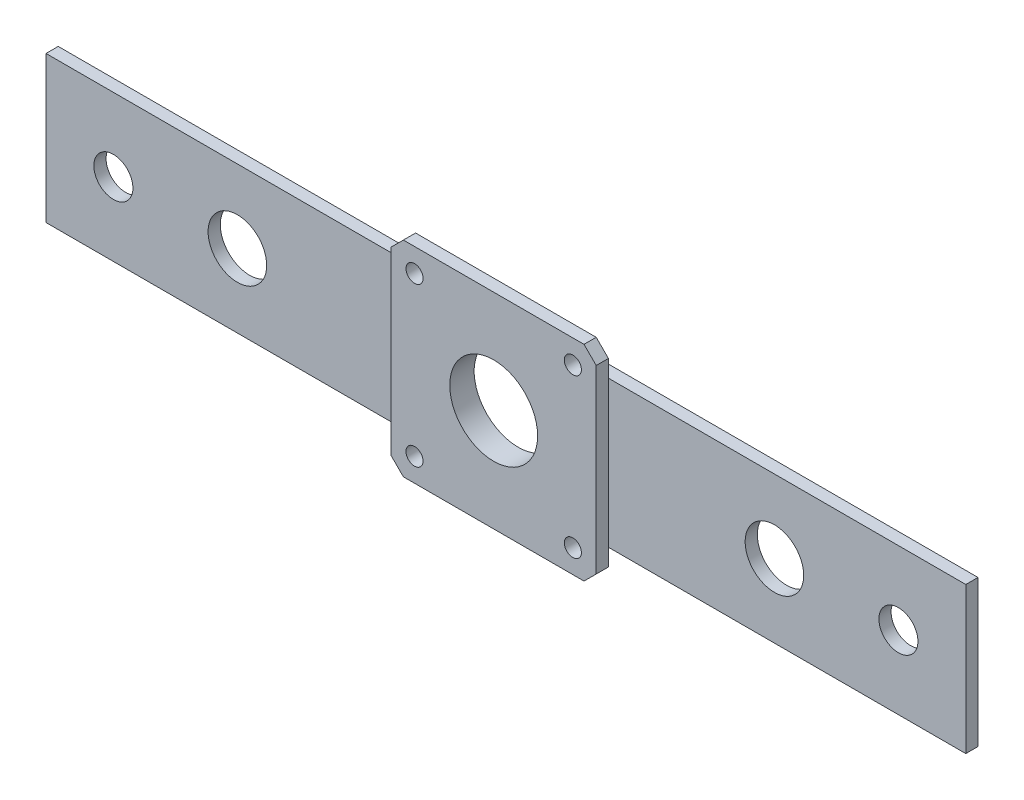
ISO-10303-21;
HEADER;
FILE_DESCRIPTION(('STEP AP214'),'2;1');
FILE_NAME('part.step','',(''),(''),'','','');
FILE_SCHEMA(('AUTOMOTIVE_DESIGN { 1 0 10303 214 1 1 1 1 }'));
ENDSEC;
DATA;
#1=APPLICATION_CONTEXT('core data for automotive mechanical design processes');
#2=APPLICATION_PROTOCOL_DEFINITION('international standard','automotive_design',2000,#1);
#3=PRODUCT_CONTEXT('',#1,'mechanical');
#4=PRODUCT('Part','Part','',(#3));
#5=PRODUCT_RELATED_PRODUCT_CATEGORY('part','',(#4));
#6=PRODUCT_DEFINITION_FORMATION('','',#4);
#7=PRODUCT_DEFINITION_CONTEXT('part definition',#1,'design');
#8=PRODUCT_DEFINITION('design','',#6,#7);
#9=PRODUCT_DEFINITION_SHAPE('','',#8);
#10=(LENGTH_UNIT() NAMED_UNIT(*) SI_UNIT(.MILLI.,.METRE.));
#11=(NAMED_UNIT(*) PLANE_ANGLE_UNIT() SI_UNIT($,.RADIAN.));
#12=(NAMED_UNIT(*) SI_UNIT($,.STERADIAN.) SOLID_ANGLE_UNIT());
#13=UNCERTAINTY_MEASURE_WITH_UNIT(LENGTH_MEASURE(1.E-05),#10,'distance_accuracy_value','');
#14=(GEOMETRIC_REPRESENTATION_CONTEXT(3) GLOBAL_UNCERTAINTY_ASSIGNED_CONTEXT((#13)) GLOBAL_UNIT_ASSIGNED_CONTEXT((#10,
#11,#12)) REPRESENTATION_CONTEXT('',''));
#15=CARTESIAN_POINT('',(0.,0.,0.));
#16=DIRECTION('',(0.,0.,1.));
#17=DIRECTION('',(1.,0.,0.));
#18=AXIS2_PLACEMENT_3D('',#15,#16,#17);
#19=CARTESIAN_POINT('',(0.,0.,0.));
#20=DIRECTION('',(0.,0.,1.));
#21=DIRECTION('',(1.,0.,0.));
#22=AXIS2_PLACEMENT_3D('',#19,#20,#21);
#23=PLANE('',#22);
#24=DIRECTION('',(0.,1.,0.));
#25=VECTOR('',#24,1.);
#26=CARTESIAN_POINT('',(94.2,15.,0.));
#27=LINE('',#26,#25);
#28=CARTESIAN_POINT('',(94.2,-15.,0.));
#29=VERTEX_POINT('',#28);
#30=CARTESIAN_POINT('',(94.2,15.,0.));
#31=VERTEX_POINT('',#30);
#32=EDGE_CURVE('E226',#29,#31,#27,.T.);
#33=ORIENTED_EDGE('',*,*,#32,.F.);
#34=DIRECTION('',(1.,0.,0.));
#35=VECTOR('',#34,1.);
#36=CARTESIAN_POINT('',(-94.2,-15.,0.));
#37=LINE('',#36,#35);
#38=CARTESIAN_POINT('',(-94.2,-15.,0.));
#39=VERTEX_POINT('',#38);
#40=EDGE_CURVE('E81',#39,#29,#37,.T.);
#41=ORIENTED_EDGE('',*,*,#40,.F.);
#42=DIRECTION('',(0.,-1.,0.));
#43=VECTOR('',#42,1.);
#44=CARTESIAN_POINT('',(-94.2,15.,0.));
#45=LINE('',#44,#43);
#46=CARTESIAN_POINT('',(-94.2,15.,0.));
#47=VERTEX_POINT('',#46);
#48=EDGE_CURVE('E245',#47,#39,#45,.T.);
#49=ORIENTED_EDGE('',*,*,#48,.F.);
#50=DIRECTION('',(-1.,0.,0.));
#51=VECTOR('',#50,1.);
#52=CARTESIAN_POINT('',(-94.2,15.,0.));
#53=LINE('',#52,#51);
#54=EDGE_CURVE('E243',#31,#47,#53,.T.);
#55=ORIENTED_EDGE('',*,*,#54,.F.);
#56=EDGE_LOOP('',(#33,#41,#49,#55));
#57=FACE_BOUND('',#56,.T.);
#58=CARTESIAN_POINT('',(-55.,0.,0.));
#59=DIRECTION('',(0.,0.,1.));
#60=DIRECTION('',(1.,0.,0.));
#61=AXIS2_PLACEMENT_3D('',#58,#59,#60);
#62=CIRCLE('',#61,6.00000000000001);
#63=CARTESIAN_POINT('',(-49.,0.,0.));
#64=VERTEX_POINT('',#63);
#65=EDGE_CURVE('E223',#64,#64,#62,.T.);
#66=ORIENTED_EDGE('',*,*,#65,.T.);
#67=EDGE_LOOP('',(#66));
#68=FACE_BOUND('',#67,.T.);
#69=CARTESIAN_POINT('',(-80.4,0.,0.));
#70=DIRECTION('',(0.,0.,1.));
#71=DIRECTION('',(1.,0.,0.));
#72=AXIS2_PLACEMENT_3D('',#69,#70,#71);
#73=CIRCLE('',#72,4.00000000000001);
#74=CARTESIAN_POINT('',(-76.4,0.,0.));
#75=VERTEX_POINT('',#74);
#76=EDGE_CURVE('E217',#75,#75,#73,.T.);
#77=ORIENTED_EDGE('',*,*,#76,.T.);
#78=EDGE_LOOP('',(#77));
#79=FACE_BOUND('',#78,.T.);
#80=CARTESIAN_POINT('',(55.,0.,0.));
#81=DIRECTION('',(0.,0.,1.));
#82=DIRECTION('',(-1.,0.,0.));
#83=AXIS2_PLACEMENT_3D('',#80,#81,#82);
#84=CIRCLE('',#83,6.00000000000001);
#85=CARTESIAN_POINT('',(49.,0.,0.));
#86=VERTEX_POINT('',#85);
#87=EDGE_CURVE('E211',#86,#86,#84,.T.);
#88=ORIENTED_EDGE('',*,*,#87,.T.);
#89=EDGE_LOOP('',(#88));
#90=FACE_BOUND('',#89,.T.);
#91=CARTESIAN_POINT('',(80.4,0.,0.));
#92=DIRECTION('',(0.,0.,1.));
#93=DIRECTION('',(-1.,0.,0.));
#94=AXIS2_PLACEMENT_3D('',#91,#92,#93);
#95=CIRCLE('',#94,4.00000000000001);
#96=CARTESIAN_POINT('',(76.4,0.,0.));
#97=VERTEX_POINT('',#96);
#98=EDGE_CURVE('E202',#97,#97,#95,.T.);
#99=ORIENTED_EDGE('',*,*,#98,.T.);
#100=EDGE_LOOP('',(#99));
#101=FACE_BOUND('',#100,.T.);
#102=CARTESIAN_POINT('',(0.,0.,0.));
#103=DIRECTION('',(0.,0.,1.));
#104=DIRECTION('',(1.,0.,0.));
#105=AXIS2_PLACEMENT_3D('',#102,#103,#104);
#106=CIRCLE('',#105,9.);
#107=CARTESIAN_POINT('',(9.,0.,0.));
#108=VERTEX_POINT('',#107);
#109=EDGE_CURVE('E309',#108,#108,#106,.F.);
#110=ORIENTED_EDGE('',*,*,#109,.F.);
#111=EDGE_LOOP('',(#110));
#112=FACE_BOUND('',#111,.T.);
#113=ADVANCED_FACE('F32',(#57,#68,#79,#90,#101,#112),#23,.F.);
#114=CARTESIAN_POINT('',(0.,0.,5.));
#115=DIRECTION('',(0.,0.,-1.));
#116=DIRECTION('',(-1.,0.,0.));
#117=AXIS2_PLACEMENT_3D('',#114,#115,#116);
#118=PLANE('',#117);
#119=CARTESIAN_POINT('',(-16.2144660940673,16.2144660940673,5.));
#120=DIRECTION('',(0.,0.,1.));
#121=DIRECTION('',(-1.,0.,0.));
#122=AXIS2_PLACEMENT_3D('',#119,#120,#121);
#123=CIRCLE('',#122,1.75);
#124=CARTESIAN_POINT('',(-17.9644660940673,16.2144660940673,5.));
#125=VERTEX_POINT('',#124);
#126=EDGE_CURVE('E306',#125,#125,#123,.T.);
#127=ORIENTED_EDGE('',*,*,#126,.F.);
#128=EDGE_LOOP('',(#127));
#129=FACE_BOUND('',#128,.T.);
#130=CARTESIAN_POINT('',(-16.2144660940673,-16.2144660940673,5.));
#131=DIRECTION('',(0.,0.,1.));
#132=DIRECTION('',(-1.,0.,0.));
#133=AXIS2_PLACEMENT_3D('',#130,#131,#132);
#134=CIRCLE('',#133,1.75000000000001);
#135=CARTESIAN_POINT('',(-17.9644660940673,-16.2144660940673,5.));
#136=VERTEX_POINT('',#135);
#137=EDGE_CURVE('E292',#136,#136,#134,.T.);
#138=ORIENTED_EDGE('',*,*,#137,.F.);
#139=EDGE_LOOP('',(#138));
#140=FACE_BOUND('',#139,.T.);
#141=DIRECTION('',(-1.,0.,0.));
#142=VECTOR('',#141,1.);
#143=CARTESIAN_POINT('',(-18.5,21.,5.));
#144=LINE('',#143,#142);
#145=CARTESIAN_POINT('',(18.5,21.,5.));
#146=VERTEX_POINT('',#145);
#147=CARTESIAN_POINT('',(-18.5,21.,5.));
#148=VERTEX_POINT('',#147);
#149=EDGE_CURVE('E184',#146,#148,#144,.T.);
#150=ORIENTED_EDGE('',*,*,#149,.T.);
#151=DIRECTION('',(-0.707106781186547,-0.707106781186547,0.));
#152=VECTOR('',#151,1.);
#153=CARTESIAN_POINT('',(-21.,18.5,5.));
#154=LINE('',#153,#152);
#155=CARTESIAN_POINT('',(-21.,18.5,5.));
#156=VERTEX_POINT('',#155);
#157=EDGE_CURVE('E173',#148,#156,#154,.T.);
#158=ORIENTED_EDGE('',*,*,#157,.T.);
#159=DIRECTION('',(0.,-1.,0.));
#160=VECTOR('',#159,1.);
#161=CARTESIAN_POINT('',(-21.,18.5,5.));
#162=LINE('',#161,#160);
#163=CARTESIAN_POINT('',(-21.,-18.5,5.));
#164=VERTEX_POINT('',#163);
#165=EDGE_CURVE('E183',#156,#164,#162,.T.);
#166=ORIENTED_EDGE('',*,*,#165,.T.);
#167=DIRECTION('',(0.707106781186547,-0.707106781186547,0.));
#168=VECTOR('',#167,1.);
#169=CARTESIAN_POINT('',(-21.,-18.5,5.));
#170=LINE('',#169,#168);
#171=CARTESIAN_POINT('',(-18.5,-21.,5.));
#172=VERTEX_POINT('',#171);
#173=EDGE_CURVE('E280',#164,#172,#170,.T.);
#174=ORIENTED_EDGE('',*,*,#173,.T.);
#175=DIRECTION('',(1.,0.,0.));
#176=VECTOR('',#175,1.);
#177=CARTESIAN_POINT('',(-18.5,-21.,5.));
#178=LINE('',#177,#176);
#179=CARTESIAN_POINT('',(18.5,-21.,5.));
#180=VERTEX_POINT('',#179);
#181=EDGE_CURVE('E278',#172,#180,#178,.T.);
#182=ORIENTED_EDGE('',*,*,#181,.T.);
#183=DIRECTION('',(0.707106781186547,0.707106781186547,0.));
#184=VECTOR('',#183,1.);
#185=CARTESIAN_POINT('',(18.5,-21.,5.));
#186=LINE('',#185,#184);
#187=CARTESIAN_POINT('',(21.,-18.5,5.));
#188=VERTEX_POINT('',#187);
#189=EDGE_CURVE('E276',#180,#188,#186,.T.);
#190=ORIENTED_EDGE('',*,*,#189,.T.);
#191=DIRECTION('',(0.,1.,0.));
#192=VECTOR('',#191,1.);
#193=CARTESIAN_POINT('',(21.,18.5,5.));
#194=LINE('',#193,#192);
#195=CARTESIAN_POINT('',(21.,18.5,5.));
#196=VERTEX_POINT('',#195);
#197=EDGE_CURVE('E274',#188,#196,#194,.T.);
#198=ORIENTED_EDGE('',*,*,#197,.T.);
#199=DIRECTION('',(-0.707106781186547,0.707106781186547,0.));
#200=VECTOR('',#199,1.);
#201=CARTESIAN_POINT('',(18.5,21.,5.));
#202=LINE('',#201,#200);
#203=EDGE_CURVE('E190',#196,#146,#202,.T.);
#204=ORIENTED_EDGE('',*,*,#203,.T.);
#205=EDGE_LOOP('',(#150,#158,#166,#174,#182,#190,#198,#204));
#206=FACE_BOUND('',#205,.T.);
#207=CARTESIAN_POINT('',(16.2144660940673,16.2144660940673,5.));
#208=DIRECTION('',(0.,0.,1.));
#209=DIRECTION('',(1.,0.,0.));
#210=AXIS2_PLACEMENT_3D('',#207,#208,#209);
#211=CIRCLE('',#210,1.75);
#212=CARTESIAN_POINT('',(17.9644660940673,16.2144660940673,5.));
#213=VERTEX_POINT('',#212);
#214=EDGE_CURVE('E269',#213,#213,#211,.T.);
#215=ORIENTED_EDGE('',*,*,#214,.F.);
#216=EDGE_LOOP('',(#215));
#217=FACE_BOUND('',#216,.T.);
#218=CARTESIAN_POINT('',(16.2144660940673,-16.2144660940673,5.));
#219=DIRECTION('',(0.,0.,1.));
#220=DIRECTION('',(1.,0.,0.));
#221=AXIS2_PLACEMENT_3D('',#218,#219,#220);
#222=CIRCLE('',#221,1.75);
#223=CARTESIAN_POINT('',(17.9644660940673,-16.2144660940673,5.));
#224=VERTEX_POINT('',#223);
#225=EDGE_CURVE('E299',#224,#224,#222,.T.);
#226=ORIENTED_EDGE('',*,*,#225,.F.);
#227=EDGE_LOOP('',(#226));
#228=FACE_BOUND('',#227,.T.);
#229=CARTESIAN_POINT('',(0.,0.,5.));
#230=DIRECTION('',(0.,0.,-1.));
#231=DIRECTION('',(-1.,0.,0.));
#232=AXIS2_PLACEMENT_3D('',#229,#230,#231);
#233=CIRCLE('',#232,9.);
#234=CARTESIAN_POINT('',(-9.,0.,5.));
#235=VERTEX_POINT('',#234);
#236=EDGE_CURVE('E36',#235,#235,#233,.F.);
#237=ORIENTED_EDGE('',*,*,#236,.F.);
#238=EDGE_LOOP('',(#237));
#239=FACE_BOUND('',#238,.T.);
#240=ADVANCED_FACE('F187',(#129,#140,#206,#217,#228,#239),#118,.F.);
#241=CARTESIAN_POINT('',(0.,0.,2.5));
#242=DIRECTION('',(0.,0.,1.));
#243=DIRECTION('',(1.,0.,0.));
#244=AXIS2_PLACEMENT_3D('',#241,#242,#243);
#245=PLANE('',#244);
#246=DIRECTION('',(1.,0.,0.));
#247=VECTOR('',#246,1.);
#248=CARTESIAN_POINT('',(-94.2,-15.,2.5));
#249=LINE('',#248,#247);
#250=CARTESIAN_POINT('',(14.9544771630203,-15.,2.5));
#251=VERTEX_POINT('',#250);
#252=CARTESIAN_POINT('',(17.4744550251143,-15.,2.5));
#253=VERTEX_POINT('',#252);
#254=EDGE_CURVE('E414',#251,#253,#249,.T.);
#255=ORIENTED_EDGE('',*,*,#254,.T.);
#256=CARTESIAN_POINT('',(16.2144660940673,-16.2144660940673,2.5));
#257=DIRECTION('',(0.,0.,1.));
#258=DIRECTION('',(1.,0.,0.));
#259=AXIS2_PLACEMENT_3D('',#256,#257,#258);
#260=CIRCLE('',#259,1.75);
#261=EDGE_CURVE('E296',#253,#251,#260,.T.);
#262=ORIENTED_EDGE('',*,*,#261,.T.);
#263=EDGE_LOOP('',(#255,#262));
#264=FACE_BOUND('',#263,.T.);
#265=ADVANCED_FACE('F319',(#264),#245,.T.);
#266=DIRECTION('',(-1.,0.,0.));
#267=VECTOR('',#266,1.);
#268=CARTESIAN_POINT('',(-94.2,15.,2.5));
#269=LINE('',#268,#267);
#270=CARTESIAN_POINT('',(17.4744550251143,15.,2.5));
#271=VERTEX_POINT('',#270);
#272=CARTESIAN_POINT('',(14.9544771630202,15.,2.5));
#273=VERTEX_POINT('',#272);
#274=EDGE_CURVE('E454',#271,#273,#269,.T.);
#275=ORIENTED_EDGE('',*,*,#274,.T.);
#276=CARTESIAN_POINT('',(16.2144660940673,16.2144660940673,2.5));
#277=DIRECTION('',(0.,0.,1.));
#278=DIRECTION('',(1.,0.,0.));
#279=AXIS2_PLACEMENT_3D('',#276,#277,#278);
#280=CIRCLE('',#279,1.75);
#281=EDGE_CURVE('E283',#273,#271,#280,.T.);
#282=ORIENTED_EDGE('',*,*,#281,.T.);
#283=EDGE_LOOP('',(#275,#282));
#284=FACE_BOUND('',#283,.T.);
#285=ADVANCED_FACE('F326',(#284),#245,.T.);
#286=DIRECTION('',(0.,1.,0.));
#287=VECTOR('',#286,1.);
#288=CARTESIAN_POINT('',(21.,18.5,2.5));
#289=LINE('',#288,#287);
#290=CARTESIAN_POINT('',(21.,-15.,2.5));
#291=VERTEX_POINT('',#290);
#292=CARTESIAN_POINT('',(21.,15.,2.5));
#293=VERTEX_POINT('',#292);
#294=EDGE_CURVE('E11',#291,#293,#289,.T.);
#295=ORIENTED_EDGE('',*,*,#294,.F.);
#296=CARTESIAN_POINT('',(94.2,-15.,2.5));
#297=VERTEX_POINT('',#296);
#298=EDGE_CURVE('E59',#291,#297,#249,.T.);
#299=ORIENTED_EDGE('',*,*,#298,.T.);
#300=DIRECTION('',(0.,1.,0.));
#301=VECTOR('',#300,1.);
#302=CARTESIAN_POINT('',(94.2,15.,2.5));
#303=LINE('',#302,#301);
#304=CARTESIAN_POINT('',(94.2,15.,2.5));
#305=VERTEX_POINT('',#304);
#306=EDGE_CURVE('E229',#297,#305,#303,.T.);
#307=ORIENTED_EDGE('',*,*,#306,.T.);
#308=EDGE_CURVE('E89',#305,#293,#269,.T.);
#309=ORIENTED_EDGE('',*,*,#308,.T.);
#310=EDGE_LOOP('',(#295,#299,#307,#309));
#311=FACE_BOUND('',#310,.T.);
#312=CARTESIAN_POINT('',(55.,0.,2.5));
#313=DIRECTION('',(0.,0.,1.));
#314=DIRECTION('',(-1.,0.,0.));
#315=AXIS2_PLACEMENT_3D('',#312,#313,#314);
#316=CIRCLE('',#315,6.00000000000001);
#317=CARTESIAN_POINT('',(49.,0.,2.5));
#318=VERTEX_POINT('',#317);
#319=EDGE_CURVE('E209',#318,#318,#316,.T.);
#320=ORIENTED_EDGE('',*,*,#319,.F.);
#321=EDGE_LOOP('',(#320));
#322=FACE_BOUND('',#321,.T.);
#323=CARTESIAN_POINT('',(80.4,0.,2.5));
#324=DIRECTION('',(0.,0.,1.));
#325=DIRECTION('',(-1.,0.,0.));
#326=AXIS2_PLACEMENT_3D('',#323,#324,#325);
#327=CIRCLE('',#326,4.00000000000001);
#328=CARTESIAN_POINT('',(76.4,0.,2.5));
#329=VERTEX_POINT('',#328);
#330=EDGE_CURVE('E199',#329,#329,#327,.T.);
#331=ORIENTED_EDGE('',*,*,#330,.F.);
#332=EDGE_LOOP('',(#331));
#333=FACE_BOUND('',#332,.T.);
#334=ADVANCED_FACE('F432',(#311,#322,#333),#245,.T.);
#335=CARTESIAN_POINT('',(-17.4744550251143,-15.,2.5));
#336=VERTEX_POINT('',#335);
#337=CARTESIAN_POINT('',(-14.9544771630202,-15.,2.5));
#338=VERTEX_POINT('',#337);
#339=EDGE_CURVE('E418',#336,#338,#249,.T.);
#340=ORIENTED_EDGE('',*,*,#339,.T.);
#341=CARTESIAN_POINT('',(-16.2144660940673,-16.2144660940673,2.5));
#342=DIRECTION('',(0.,0.,1.));
#343=DIRECTION('',(-1.,0.,0.));
#344=AXIS2_PLACEMENT_3D('',#341,#342,#343);
#345=CIRCLE('',#344,1.75000000000001);
#346=EDGE_CURVE('E289',#338,#336,#345,.T.);
#347=ORIENTED_EDGE('',*,*,#346,.T.);
#348=EDGE_LOOP('',(#340,#347));
#349=FACE_BOUND('',#348,.T.);
#350=ADVANCED_FACE('F430',(#349),#245,.T.);
#351=CARTESIAN_POINT('',(-14.9544771630202,15.,2.5));
#352=VERTEX_POINT('',#351);
#353=CARTESIAN_POINT('',(-17.4744550251143,15.,2.5));
#354=VERTEX_POINT('',#353);
#355=EDGE_CURVE('E458',#352,#354,#269,.T.);
#356=ORIENTED_EDGE('',*,*,#355,.T.);
#357=CARTESIAN_POINT('',(-16.2144660940673,16.2144660940673,2.5));
#358=DIRECTION('',(0.,0.,1.));
#359=DIRECTION('',(-1.,0.,0.));
#360=AXIS2_PLACEMENT_3D('',#357,#358,#359);
#361=CIRCLE('',#360,1.75);
#362=EDGE_CURVE('E303',#354,#352,#361,.T.);
#363=ORIENTED_EDGE('',*,*,#362,.T.);
#364=EDGE_LOOP('',(#356,#363));
#365=FACE_BOUND('',#364,.T.);
#366=ADVANCED_FACE('F389',(#365),#245,.T.);
#367=CARTESIAN_POINT('',(94.2,15.,2.5));
#368=DIRECTION('',(-1.,0.,0.));
#369=DIRECTION('',(0.,0.,1.));
#370=AXIS2_PLACEMENT_3D('',#367,#368,#369);
#371=PLANE('',#370);
#372=ORIENTED_EDGE('',*,*,#32,.T.);
#373=DIRECTION('',(0.,0.,-1.));
#374=VECTOR('',#373,1.);
#375=CARTESIAN_POINT('',(94.2,15.,2.5));
#376=LINE('',#375,#374);
#377=EDGE_CURVE('E253',#305,#31,#376,.T.);
#378=ORIENTED_EDGE('',*,*,#377,.F.);
#379=ORIENTED_EDGE('',*,*,#306,.F.);
#380=DIRECTION('',(0.,0.,-1.));
#381=VECTOR('',#380,1.);
#382=CARTESIAN_POINT('',(94.2,-15.,2.5));
#383=LINE('',#382,#381);
#384=EDGE_CURVE('E239',#297,#29,#383,.T.);
#385=ORIENTED_EDGE('',*,*,#384,.T.);
#386=EDGE_LOOP('',(#372,#378,#379,#385));
#387=FACE_BOUND('',#386,.T.);
#388=ADVANCED_FACE('F34',(#387),#371,.F.);
#389=CARTESIAN_POINT('',(-94.2,15.,2.5));
#390=DIRECTION('',(0.,-1.,0.));
#391=DIRECTION('',(0.,0.,-1.));
#392=AXIS2_PLACEMENT_3D('',#389,#390,#391);
#393=PLANE('',#392);
#394=ORIENTED_EDGE('',*,*,#54,.T.);
#395=DIRECTION('',(0.,0.,-1.));
#396=VECTOR('',#395,1.);
#397=CARTESIAN_POINT('',(-94.2,15.,2.5));
#398=LINE('',#397,#396);
#399=CARTESIAN_POINT('',(-94.2,15.,2.5));
#400=VERTEX_POINT('',#399);
#401=EDGE_CURVE('E251',#400,#47,#398,.T.);
#402=ORIENTED_EDGE('',*,*,#401,.F.);
#403=CARTESIAN_POINT('',(-21.,15.,2.5));
#404=VERTEX_POINT('',#403);
#405=EDGE_CURVE('E231',#404,#400,#269,.T.);
#406=ORIENTED_EDGE('',*,*,#405,.F.);
#407=EDGE_CURVE('E460',#354,#404,#269,.T.);
#408=ORIENTED_EDGE('',*,*,#407,.F.);
#409=ORIENTED_EDGE('',*,*,#355,.F.);
#410=EDGE_CURVE('E457',#273,#352,#269,.T.);
#411=ORIENTED_EDGE('',*,*,#410,.F.);
#412=ORIENTED_EDGE('',*,*,#274,.F.);
#413=EDGE_CURVE('E234',#293,#271,#269,.T.);
#414=ORIENTED_EDGE('',*,*,#413,.F.);
#415=ORIENTED_EDGE('',*,*,#308,.F.);
#416=ORIENTED_EDGE('',*,*,#377,.T.);
#417=EDGE_LOOP('',(#394,#402,#406,#408,#409,#411,#412,#414,#415,#416));
#418=FACE_BOUND('',#417,.T.);
#419=ADVANCED_FACE('F395',(#418),#393,.F.);
#420=CARTESIAN_POINT('',(-94.2,15.,2.5));
#421=DIRECTION('',(1.,0.,0.));
#422=DIRECTION('',(0.,0.,-1.));
#423=AXIS2_PLACEMENT_3D('',#420,#421,#422);
#424=PLANE('',#423);
#425=ORIENTED_EDGE('',*,*,#48,.T.);
#426=DIRECTION('',(0.,0.,-1.));
#427=VECTOR('',#426,1.);
#428=CARTESIAN_POINT('',(-94.2,-15.,2.5));
#429=LINE('',#428,#427);
#430=CARTESIAN_POINT('',(-94.2,-15.,2.5));
#431=VERTEX_POINT('',#430);
#432=EDGE_CURVE('E249',#431,#39,#429,.T.);
#433=ORIENTED_EDGE('',*,*,#432,.F.);
#434=DIRECTION('',(0.,-1.,0.));
#435=VECTOR('',#434,1.);
#436=CARTESIAN_POINT('',(-94.2,15.,2.5));
#437=LINE('',#436,#435);
#438=EDGE_CURVE('E233',#400,#431,#437,.T.);
#439=ORIENTED_EDGE('',*,*,#438,.F.);
#440=ORIENTED_EDGE('',*,*,#401,.T.);
#441=EDGE_LOOP('',(#425,#433,#439,#440));
#442=FACE_BOUND('',#441,.T.);
#443=ADVANCED_FACE('F393',(#442),#424,.F.);
#444=CARTESIAN_POINT('',(-94.2,-15.,2.5));
#445=DIRECTION('',(0.,1.,0.));
#446=DIRECTION('',(0.,0.,1.));
#447=AXIS2_PLACEMENT_3D('',#444,#445,#446);
#448=PLANE('',#447);
#449=ORIENTED_EDGE('',*,*,#40,.T.);
#450=ORIENTED_EDGE('',*,*,#384,.F.);
#451=ORIENTED_EDGE('',*,*,#298,.F.);
#452=EDGE_CURVE('E412',#253,#291,#249,.T.);
#453=ORIENTED_EDGE('',*,*,#452,.F.);
#454=ORIENTED_EDGE('',*,*,#254,.F.);
#455=EDGE_CURVE('E417',#338,#251,#249,.T.);
#456=ORIENTED_EDGE('',*,*,#455,.F.);
#457=ORIENTED_EDGE('',*,*,#339,.F.);
#458=CARTESIAN_POINT('',(-21.,-15.,2.5));
#459=VERTEX_POINT('',#458);
#460=EDGE_CURVE('E240',#459,#336,#249,.T.);
#461=ORIENTED_EDGE('',*,*,#460,.F.);
#462=EDGE_CURVE('E236',#431,#459,#249,.T.);
#463=ORIENTED_EDGE('',*,*,#462,.F.);
#464=ORIENTED_EDGE('',*,*,#432,.T.);
#465=EDGE_LOOP('',(#449,#450,#451,#453,#454,#456,#457,#461,#463,#464));
#466=FACE_BOUND('',#465,.T.);
#467=ADVANCED_FACE('F387',(#466),#448,.F.);
#468=DIRECTION('',(0.,-1.,0.));
#469=VECTOR('',#468,1.);
#470=CARTESIAN_POINT('',(-21.,18.5,2.5));
#471=LINE('',#470,#469);
#472=EDGE_CURVE('E41',#404,#459,#471,.T.);
#473=ORIENTED_EDGE('',*,*,#472,.F.);
#474=ORIENTED_EDGE('',*,*,#405,.T.);
#475=ORIENTED_EDGE('',*,*,#438,.T.);
#476=ORIENTED_EDGE('',*,*,#462,.T.);
#477=EDGE_LOOP('',(#473,#474,#475,#476));
#478=FACE_BOUND('',#477,.T.);
#479=CARTESIAN_POINT('',(-80.4,0.,2.5));
#480=DIRECTION('',(0.,0.,1.));
#481=DIRECTION('',(1.,0.,0.));
#482=AXIS2_PLACEMENT_3D('',#479,#480,#481);
#483=CIRCLE('',#482,4.00000000000001);
#484=CARTESIAN_POINT('',(-76.4,0.,2.5));
#485=VERTEX_POINT('',#484);
#486=EDGE_CURVE('E214',#485,#485,#483,.T.);
#487=ORIENTED_EDGE('',*,*,#486,.F.);
#488=EDGE_LOOP('',(#487));
#489=FACE_BOUND('',#488,.T.);
#490=CARTESIAN_POINT('',(-55.,0.,2.5));
#491=DIRECTION('',(0.,0.,1.));
#492=DIRECTION('',(1.,0.,0.));
#493=AXIS2_PLACEMENT_3D('',#490,#491,#492);
#494=CIRCLE('',#493,6.00000000000001);
#495=CARTESIAN_POINT('',(-49.,0.,2.5));
#496=VERTEX_POINT('',#495);
#497=EDGE_CURVE('E220',#496,#496,#494,.T.);
#498=ORIENTED_EDGE('',*,*,#497,.F.);
#499=EDGE_LOOP('',(#498));
#500=FACE_BOUND('',#499,.T.);
#501=ADVANCED_FACE('F329',(#478,#489,#500),#245,.T.);
#502=CARTESIAN_POINT('',(-55.,0.,0.));
#503=DIRECTION('',(0.,0.,1.));
#504=DIRECTION('',(1.,0.,0.));
#505=AXIS2_PLACEMENT_3D('',#502,#503,#504);
#506=CYLINDRICAL_SURFACE('',#505,6.00000000000001);
#507=ORIENTED_EDGE('',*,*,#65,.F.);
#508=EDGE_LOOP('',(#507));
#509=FACE_BOUND('',#508,.T.);
#510=ORIENTED_EDGE('',*,*,#497,.T.);
#511=EDGE_LOOP('',(#510));
#512=FACE_BOUND('',#511,.T.);
#513=ADVANCED_FACE('F382',(#509,#512),#506,.F.);
#514=CARTESIAN_POINT('',(-80.4,0.,0.));
#515=DIRECTION('',(0.,0.,1.));
#516=DIRECTION('',(1.,0.,0.));
#517=AXIS2_PLACEMENT_3D('',#514,#515,#516);
#518=CYLINDRICAL_SURFACE('',#517,4.00000000000001);
#519=ORIENTED_EDGE('',*,*,#76,.F.);
#520=EDGE_LOOP('',(#519));
#521=FACE_BOUND('',#520,.T.);
#522=ORIENTED_EDGE('',*,*,#486,.T.);
#523=EDGE_LOOP('',(#522));
#524=FACE_BOUND('',#523,.T.);
#525=ADVANCED_FACE('F378',(#521,#524),#518,.F.);
#526=CARTESIAN_POINT('',(55.,0.,0.));
#527=DIRECTION('',(0.,0.,1.));
#528=DIRECTION('',(1.,0.,0.));
#529=AXIS2_PLACEMENT_3D('',#526,#527,#528);
#530=CYLINDRICAL_SURFACE('',#529,6.00000000000001);
#531=ORIENTED_EDGE('',*,*,#87,.F.);
#532=EDGE_LOOP('',(#531));
#533=FACE_BOUND('',#532,.T.);
#534=ORIENTED_EDGE('',*,*,#319,.T.);
#535=EDGE_LOOP('',(#534));
#536=FACE_BOUND('',#535,.T.);
#537=ADVANCED_FACE('F374',(#533,#536),#530,.F.);
#538=CARTESIAN_POINT('',(80.4,0.,0.));
#539=DIRECTION('',(0.,0.,1.));
#540=DIRECTION('',(1.,0.,0.));
#541=AXIS2_PLACEMENT_3D('',#538,#539,#540);
#542=CYLINDRICAL_SURFACE('',#541,4.00000000000001);
#543=ORIENTED_EDGE('',*,*,#98,.F.);
#544=EDGE_LOOP('',(#543));
#545=FACE_BOUND('',#544,.T.);
#546=ORIENTED_EDGE('',*,*,#330,.T.);
#547=EDGE_LOOP('',(#546));
#548=FACE_BOUND('',#547,.T.);
#549=ADVANCED_FACE('F370',(#545,#548),#542,.F.);
#550=CARTESIAN_POINT('',(-16.2144660940673,16.2144660940673,5.));
#551=DIRECTION('',(0.,0.,-1.));
#552=DIRECTION('',(-1.,0.,0.));
#553=AXIS2_PLACEMENT_3D('',#550,#551,#552);
#554=CYLINDRICAL_SURFACE('',#553,1.75);
#555=ORIENTED_EDGE('',*,*,#126,.T.);
#556=EDGE_LOOP('',(#555));
#557=FACE_BOUND('',#556,.T.);
#558=ORIENTED_EDGE('',*,*,#362,.F.);
#559=EDGE_CURVE('E50',#352,#354,#361,.T.);
#560=ORIENTED_EDGE('',*,*,#559,.F.);
#561=EDGE_LOOP('',(#558,#560));
#562=FACE_BOUND('',#561,.T.);
#563=ADVANCED_FACE('F373',(#557,#562),#554,.F.);
#564=CARTESIAN_POINT('',(16.2144660940673,-16.2144660940673,5.));
#565=DIRECTION('',(0.,0.,-1.));
#566=DIRECTION('',(-1.,0.,0.));
#567=AXIS2_PLACEMENT_3D('',#564,#565,#566);
#568=CYLINDRICAL_SURFACE('',#567,1.75);
#569=ORIENTED_EDGE('',*,*,#225,.T.);
#570=EDGE_LOOP('',(#569));
#571=FACE_BOUND('',#570,.T.);
#572=ORIENTED_EDGE('',*,*,#261,.F.);
#573=EDGE_CURVE('E300',#251,#253,#260,.T.);
#574=ORIENTED_EDGE('',*,*,#573,.F.);
#575=EDGE_LOOP('',(#572,#574));
#576=FACE_BOUND('',#575,.T.);
#577=ADVANCED_FACE('F497',(#571,#576),#568,.F.);
#578=CARTESIAN_POINT('',(-16.2144660940673,-16.2144660940673,5.));
#579=DIRECTION('',(0.,0.,-1.));
#580=DIRECTION('',(-1.,0.,0.));
#581=AXIS2_PLACEMENT_3D('',#578,#579,#580);
#582=CYLINDRICAL_SURFACE('',#581,1.75000000000001);
#583=ORIENTED_EDGE('',*,*,#137,.T.);
#584=EDGE_LOOP('',(#583));
#585=FACE_BOUND('',#584,.T.);
#586=ORIENTED_EDGE('',*,*,#346,.F.);
#587=EDGE_CURVE('E293',#336,#338,#345,.T.);
#588=ORIENTED_EDGE('',*,*,#587,.F.);
#589=EDGE_LOOP('',(#586,#588));
#590=FACE_BOUND('',#589,.T.);
#591=ADVANCED_FACE('F429',(#585,#590),#582,.F.);
#592=CARTESIAN_POINT('',(16.2144660940673,16.2144660940673,5.));
#593=DIRECTION('',(0.,0.,-1.));
#594=DIRECTION('',(-1.,0.,0.));
#595=AXIS2_PLACEMENT_3D('',#592,#593,#594);
#596=CYLINDRICAL_SURFACE('',#595,1.75);
#597=ORIENTED_EDGE('',*,*,#214,.T.);
#598=EDGE_LOOP('',(#597));
#599=FACE_BOUND('',#598,.T.);
#600=ORIENTED_EDGE('',*,*,#281,.F.);
#601=EDGE_CURVE('E286',#271,#273,#280,.T.);
#602=ORIENTED_EDGE('',*,*,#601,.F.);
#603=EDGE_LOOP('',(#600,#602));
#604=FACE_BOUND('',#603,.T.);
#605=ADVANCED_FACE('F336',(#599,#604),#596,.F.);
#606=CARTESIAN_POINT('',(18.5,21.,5.));
#607=DIRECTION('',(-0.707106781186548,-0.707106781186548,0.));
#608=DIRECTION('',(0.707106781186548,-0.707106781186548,0.));
#609=AXIS2_PLACEMENT_3D('',#606,#607,#608);
#610=PLANE('',#609);
#611=DIRECTION('',(-0.707106781186547,0.707106781186547,0.));
#612=VECTOR('',#611,1.);
#613=CARTESIAN_POINT('',(18.5,21.,2.5));
#614=LINE('',#613,#612);
#615=CARTESIAN_POINT('',(21.,18.5,2.5));
#616=VERTEX_POINT('',#615);
#617=CARTESIAN_POINT('',(18.5,21.,2.5));
#618=VERTEX_POINT('',#617);
#619=EDGE_CURVE('E194',#616,#618,#614,.T.);
#620=ORIENTED_EDGE('',*,*,#619,.T.);
#621=DIRECTION('',(0.,0.,-1.));
#622=VECTOR('',#621,1.);
#623=CARTESIAN_POINT('',(18.5,21.,5.));
#624=LINE('',#623,#622);
#625=EDGE_CURVE('E273',#146,#618,#624,.T.);
#626=ORIENTED_EDGE('',*,*,#625,.F.);
#627=ORIENTED_EDGE('',*,*,#203,.F.);
#628=DIRECTION('',(0.,0.,-1.));
#629=VECTOR('',#628,1.);
#630=CARTESIAN_POINT('',(21.,18.5,5.));
#631=LINE('',#630,#629);
#632=EDGE_CURVE('E487',#196,#616,#631,.T.);
#633=ORIENTED_EDGE('',*,*,#632,.T.);
#634=EDGE_LOOP('',(#620,#626,#627,#633));
#635=FACE_BOUND('',#634,.T.);
#636=ADVANCED_FACE('F343',(#635),#610,.F.);
#637=CARTESIAN_POINT('',(21.,18.5,5.));
#638=DIRECTION('',(-1.,0.,0.));
#639=DIRECTION('',(0.,-1.,0.));
#640=AXIS2_PLACEMENT_3D('',#637,#638,#639);
#641=PLANE('',#640);
#642=CARTESIAN_POINT('',(21.,-18.5,2.5));
#643=VERTEX_POINT('',#642);
#644=EDGE_CURVE('E43',#643,#291,#289,.T.);
#645=ORIENTED_EDGE('',*,*,#644,.T.);
#646=ORIENTED_EDGE('',*,*,#294,.T.);
#647=EDGE_CURVE('E44',#293,#616,#289,.T.);
#648=ORIENTED_EDGE('',*,*,#647,.T.);
#649=ORIENTED_EDGE('',*,*,#632,.F.);
#650=ORIENTED_EDGE('',*,*,#197,.F.);
#651=DIRECTION('',(0.,0.,-1.));
#652=VECTOR('',#651,1.);
#653=CARTESIAN_POINT('',(21.,-18.5,5.));
#654=LINE('',#653,#652);
#655=EDGE_CURVE('E483',#188,#643,#654,.T.);
#656=ORIENTED_EDGE('',*,*,#655,.T.);
#657=EDGE_LOOP('',(#645,#646,#648,#649,#650,#656));
#658=FACE_BOUND('',#657,.T.);
#659=ADVANCED_FACE('F346',(#658),#641,.F.);
#660=CARTESIAN_POINT('',(18.5,-21.,5.));
#661=DIRECTION('',(-0.707106781186548,0.707106781186548,0.));
#662=DIRECTION('',(-0.707106781186548,-0.707106781186548,0.));
#663=AXIS2_PLACEMENT_3D('',#660,#661,#662);
#664=PLANE('',#663);
#665=DIRECTION('',(0.707106781186547,0.707106781186547,0.));
#666=VECTOR('',#665,1.);
#667=CARTESIAN_POINT('',(18.5,-21.,2.5));
#668=LINE('',#667,#666);
#669=CARTESIAN_POINT('',(18.5,-21.,2.5));
#670=VERTEX_POINT('',#669);
#671=EDGE_CURVE('E493',#670,#643,#668,.T.);
#672=ORIENTED_EDGE('',*,*,#671,.T.);
#673=ORIENTED_EDGE('',*,*,#655,.F.);
#674=ORIENTED_EDGE('',*,*,#189,.F.);
#675=DIRECTION('',(0.,0.,-1.));
#676=VECTOR('',#675,1.);
#677=CARTESIAN_POINT('',(18.5,-21.,5.));
#678=LINE('',#677,#676);
#679=EDGE_CURVE('E477',#180,#670,#678,.T.);
#680=ORIENTED_EDGE('',*,*,#679,.T.);
#681=EDGE_LOOP('',(#672,#673,#674,#680));
#682=FACE_BOUND('',#681,.T.);
#683=ADVANCED_FACE('F350',(#682),#664,.F.);
#684=CARTESIAN_POINT('',(-18.5,-21.,5.));
#685=DIRECTION('',(0.,1.,0.));
#686=DIRECTION('',(0.,0.,1.));
#687=AXIS2_PLACEMENT_3D('',#684,#685,#686);
#688=PLANE('',#687);
#689=DIRECTION('',(1.,0.,0.));
#690=VECTOR('',#689,1.);
#691=CARTESIAN_POINT('',(-18.5,-21.,2.5));
#692=LINE('',#691,#690);
#693=CARTESIAN_POINT('',(-18.5,-21.,2.5));
#694=VERTEX_POINT('',#693);
#695=EDGE_CURVE('E481',#694,#670,#692,.T.);
#696=ORIENTED_EDGE('',*,*,#695,.T.);
#697=ORIENTED_EDGE('',*,*,#679,.F.);
#698=ORIENTED_EDGE('',*,*,#181,.F.);
#699=DIRECTION('',(0.,0.,-1.));
#700=VECTOR('',#699,1.);
#701=CARTESIAN_POINT('',(-18.5,-21.,5.));
#702=LINE('',#701,#700);
#703=EDGE_CURVE('E475',#172,#694,#702,.T.);
#704=ORIENTED_EDGE('',*,*,#703,.T.);
#705=EDGE_LOOP('',(#696,#697,#698,#704));
#706=FACE_BOUND('',#705,.T.);
#707=ADVANCED_FACE('F354',(#706),#688,.F.);
#708=CARTESIAN_POINT('',(-21.,-18.5,5.));
#709=DIRECTION('',(0.707106781186548,0.707106781186548,0.));
#710=DIRECTION('',(-0.707106781186548,0.707106781186548,0.));
#711=AXIS2_PLACEMENT_3D('',#708,#709,#710);
#712=PLANE('',#711);
#713=DIRECTION('',(0.707106781186547,-0.707106781186547,0.));
#714=VECTOR('',#713,1.);
#715=CARTESIAN_POINT('',(-21.,-18.5,2.5));
#716=LINE('',#715,#714);
#717=CARTESIAN_POINT('',(-21.,-18.5,2.5));
#718=VERTEX_POINT('',#717);
#719=EDGE_CURVE('E265',#718,#694,#716,.T.);
#720=ORIENTED_EDGE('',*,*,#719,.T.);
#721=ORIENTED_EDGE('',*,*,#703,.F.);
#722=ORIENTED_EDGE('',*,*,#173,.F.);
#723=DIRECTION('',(0.,0.,-1.));
#724=VECTOR('',#723,1.);
#725=CARTESIAN_POINT('',(-21.,-18.5,5.));
#726=LINE('',#725,#724);
#727=EDGE_CURVE('E204',#164,#718,#726,.T.);
#728=ORIENTED_EDGE('',*,*,#727,.T.);
#729=EDGE_LOOP('',(#720,#721,#722,#728));
#730=FACE_BOUND('',#729,.T.);
#731=ADVANCED_FACE('F358',(#730),#712,.F.);
#732=CARTESIAN_POINT('',(-21.,18.5,5.));
#733=DIRECTION('',(1.,0.,0.));
#734=DIRECTION('',(0.,1.,0.));
#735=AXIS2_PLACEMENT_3D('',#732,#733,#734);
#736=PLANE('',#735);
#737=CARTESIAN_POINT('',(-21.,18.5,2.5));
#738=VERTEX_POINT('',#737);
#739=EDGE_CURVE('E257',#738,#404,#471,.T.);
#740=ORIENTED_EDGE('',*,*,#739,.T.);
#741=ORIENTED_EDGE('',*,*,#472,.T.);
#742=EDGE_CURVE('E258',#459,#718,#471,.T.);
#743=ORIENTED_EDGE('',*,*,#742,.T.);
#744=ORIENTED_EDGE('',*,*,#727,.F.);
#745=ORIENTED_EDGE('',*,*,#165,.F.);
#746=DIRECTION('',(0.,0.,-1.));
#747=VECTOR('',#746,1.);
#748=CARTESIAN_POINT('',(-21.,18.5,5.));
#749=LINE('',#748,#747);
#750=EDGE_CURVE('E180',#156,#738,#749,.T.);
#751=ORIENTED_EDGE('',*,*,#750,.T.);
#752=EDGE_LOOP('',(#740,#741,#743,#744,#745,#751));
#753=FACE_BOUND('',#752,.T.);
#754=ADVANCED_FACE('F362',(#753),#736,.F.);
#755=CARTESIAN_POINT('',(-21.,18.5,5.));
#756=DIRECTION('',(0.707106781186548,-0.707106781186548,0.));
#757=DIRECTION('',(0.707106781186548,0.707106781186548,0.));
#758=AXIS2_PLACEMENT_3D('',#755,#756,#757);
#759=PLANE('',#758);
#760=DIRECTION('',(-0.707106781186547,-0.707106781186547,0.));
#761=VECTOR('',#760,1.);
#762=CARTESIAN_POINT('',(-21.,18.5,2.5));
#763=LINE('',#762,#761);
#764=CARTESIAN_POINT('',(-18.5,21.,2.5));
#765=VERTEX_POINT('',#764);
#766=EDGE_CURVE('E266',#765,#738,#763,.T.);
#767=ORIENTED_EDGE('',*,*,#766,.T.);
#768=ORIENTED_EDGE('',*,*,#750,.F.);
#769=ORIENTED_EDGE('',*,*,#157,.F.);
#770=DIRECTION('',(0.,0.,-1.));
#771=VECTOR('',#770,1.);
#772=CARTESIAN_POINT('',(-18.5,21.,5.));
#773=LINE('',#772,#771);
#774=EDGE_CURVE('E177',#148,#765,#773,.T.);
#775=ORIENTED_EDGE('',*,*,#774,.T.);
#776=EDGE_LOOP('',(#767,#768,#769,#775));
#777=FACE_BOUND('',#776,.T.);
#778=ADVANCED_FACE('F175',(#777),#759,.F.);
#779=CARTESIAN_POINT('',(-18.5,21.,5.));
#780=DIRECTION('',(0.,-1.,0.));
#781=DIRECTION('',(0.,0.,-1.));
#782=AXIS2_PLACEMENT_3D('',#779,#780,#781);
#783=PLANE('',#782);
#784=DIRECTION('',(-1.,0.,0.));
#785=VECTOR('',#784,1.);
#786=CARTESIAN_POINT('',(-18.5,21.,2.5));
#787=LINE('',#786,#785);
#788=EDGE_CURVE('E198',#618,#765,#787,.T.);
#789=ORIENTED_EDGE('',*,*,#788,.T.);
#790=ORIENTED_EDGE('',*,*,#774,.F.);
#791=ORIENTED_EDGE('',*,*,#149,.F.);
#792=ORIENTED_EDGE('',*,*,#625,.T.);
#793=EDGE_LOOP('',(#789,#790,#791,#792));
#794=FACE_BOUND('',#793,.T.);
#795=ADVANCED_FACE('F196',(#794),#783,.F.);
#796=CARTESIAN_POINT('',(0.,0.,2.5));
#797=DIRECTION('',(0.,0.,-1.));
#798=DIRECTION('',(-1.,0.,0.));
#799=AXIS2_PLACEMENT_3D('',#796,#797,#798);
#800=PLANE('',#799);
#801=ORIENTED_EDGE('',*,*,#742,.F.);
#802=ORIENTED_EDGE('',*,*,#460,.T.);
#803=ORIENTED_EDGE('',*,*,#587,.T.);
#804=ORIENTED_EDGE('',*,*,#455,.T.);
#805=ORIENTED_EDGE('',*,*,#573,.T.);
#806=ORIENTED_EDGE('',*,*,#452,.T.);
#807=ORIENTED_EDGE('',*,*,#644,.F.);
#808=ORIENTED_EDGE('',*,*,#671,.F.);
#809=ORIENTED_EDGE('',*,*,#695,.F.);
#810=ORIENTED_EDGE('',*,*,#719,.F.);
#811=EDGE_LOOP('',(#801,#802,#803,#804,#805,#806,#807,#808,#809,#810));
#812=FACE_BOUND('',#811,.T.);
#813=ADVANCED_FACE('F338',(#812),#800,.T.);
#814=ORIENTED_EDGE('',*,*,#647,.F.);
#815=ORIENTED_EDGE('',*,*,#413,.T.);
#816=ORIENTED_EDGE('',*,*,#601,.T.);
#817=ORIENTED_EDGE('',*,*,#410,.T.);
#818=ORIENTED_EDGE('',*,*,#559,.T.);
#819=ORIENTED_EDGE('',*,*,#407,.T.);
#820=ORIENTED_EDGE('',*,*,#739,.F.);
#821=ORIENTED_EDGE('',*,*,#766,.F.);
#822=ORIENTED_EDGE('',*,*,#788,.F.);
#823=ORIENTED_EDGE('',*,*,#619,.F.);
#824=EDGE_LOOP('',(#814,#815,#816,#817,#818,#819,#820,#821,#822,#823));
#825=FACE_BOUND('',#824,.T.);
#826=ADVANCED_FACE('F341',(#825),#800,.T.);
#827=CARTESIAN_POINT('',(0.,0.,-12.));
#828=DIRECTION('',(0.,0.,1.));
#829=DIRECTION('',(1.,0.,0.));
#830=AXIS2_PLACEMENT_3D('',#827,#828,#829);
#831=CYLINDRICAL_SURFACE('',#830,9.);
#832=ORIENTED_EDGE('',*,*,#236,.T.);
#833=EDGE_LOOP('',(#832));
#834=FACE_BOUND('',#833,.T.);
#835=ORIENTED_EDGE('',*,*,#109,.T.);
#836=EDGE_LOOP('',(#835));
#837=FACE_BOUND('',#836,.T.);
#838=ADVANCED_FACE('F316',(#834,#837),#831,.F.);
#839=CLOSED_SHELL('',(#113,#240,#265,#285,#334,#350,#366,#388,#419,#443,#467,#501,#513,#525,
#537,#549,#563,#577,#591,#605,#636,#659,#683,#707,#731,#754,#778,#795,#813,#826,#838));
#840=MANIFOLD_SOLID_BREP('B2',#839);
#841=ADVANCED_BREP_SHAPE_REPRESENTATION('',(#18,#840),#14);
#842=SHAPE_DEFINITION_REPRESENTATION(#9,#841);
ENDSEC;
END-ISO-10303-21;
